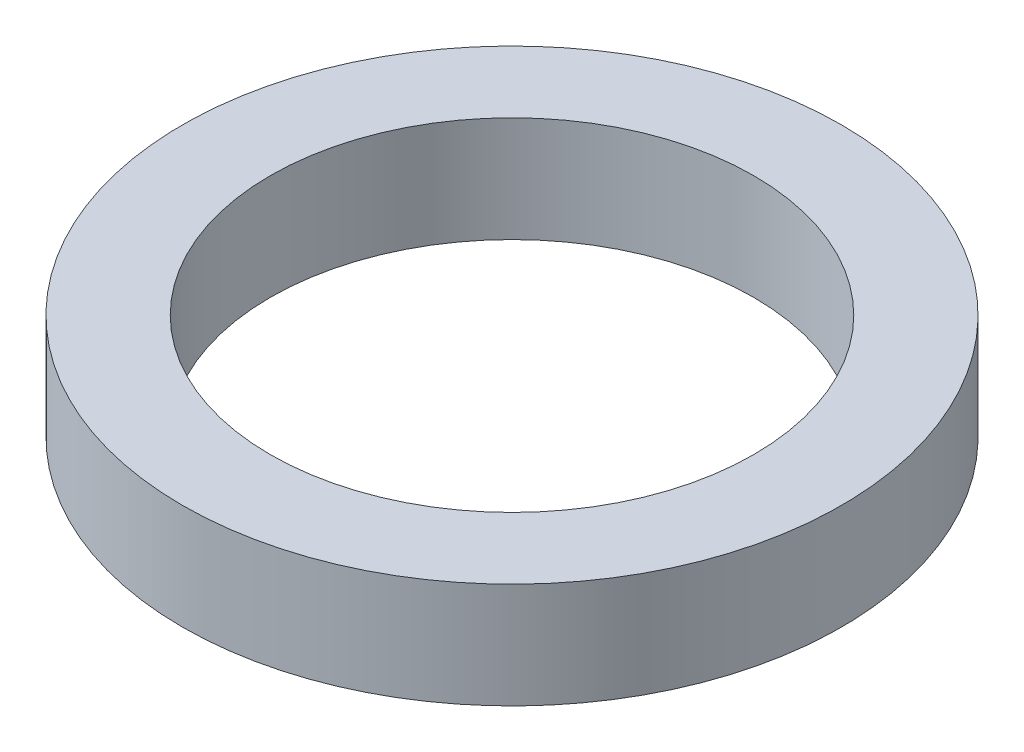
ISO-10303-21;
HEADER;
FILE_DESCRIPTION(('STEP AP214'),'2;1');
FILE_NAME('part.step','',(''),(''),'','','');
FILE_SCHEMA(('AUTOMOTIVE_DESIGN { 1 0 10303 214 1 1 1 1 }'));
ENDSEC;
DATA;
#1=APPLICATION_CONTEXT('core data for automotive mechanical design processes');
#2=APPLICATION_PROTOCOL_DEFINITION('international standard','automotive_design',2000,#1);
#3=PRODUCT_CONTEXT('',#1,'mechanical');
#4=PRODUCT('Part','Part','',(#3));
#5=PRODUCT_RELATED_PRODUCT_CATEGORY('part','',(#4));
#6=PRODUCT_DEFINITION_FORMATION('','',#4);
#7=PRODUCT_DEFINITION_CONTEXT('part definition',#1,'design');
#8=PRODUCT_DEFINITION('design','',#6,#7);
#9=PRODUCT_DEFINITION_SHAPE('','',#8);
#10=(LENGTH_UNIT() NAMED_UNIT(*) SI_UNIT(.MILLI.,.METRE.));
#11=(NAMED_UNIT(*) PLANE_ANGLE_UNIT() SI_UNIT($,.RADIAN.));
#12=(NAMED_UNIT(*) SI_UNIT($,.STERADIAN.) SOLID_ANGLE_UNIT());
#13=UNCERTAINTY_MEASURE_WITH_UNIT(LENGTH_MEASURE(1.E-05),#10,'distance_accuracy_value','');
#14=(GEOMETRIC_REPRESENTATION_CONTEXT(3) GLOBAL_UNCERTAINTY_ASSIGNED_CONTEXT((#13)) GLOBAL_UNIT_ASSIGNED_CONTEXT((#10,
#11,#12)) REPRESENTATION_CONTEXT('',''));
#15=CARTESIAN_POINT('',(0.,0.,0.));
#16=DIRECTION('',(0.,0.,1.));
#17=DIRECTION('',(1.,0.,0.));
#18=AXIS2_PLACEMENT_3D('',#15,#16,#17);
#19=CARTESIAN_POINT('',(0.,12.,0.));
#20=DIRECTION('',(0.,1.,0.));
#21=DIRECTION('',(0.,0.,1.));
#22=AXIS2_PLACEMENT_3D('',#19,#20,#21);
#23=PLANE('',#22);
#24=CARTESIAN_POINT('',(0.,12.,0.));
#25=DIRECTION('',(0.,-1.,0.));
#26=DIRECTION('',(0.,0.,-1.));
#27=AXIS2_PLACEMENT_3D('',#24,#25,#26);
#28=CIRCLE('',#27,37.5);
#29=CARTESIAN_POINT('',(0.,12.,-37.5));
#30=VERTEX_POINT('',#29);
#31=EDGE_CURVE('E26',#30,#30,#28,.T.);
#32=ORIENTED_EDGE('',*,*,#31,.F.);
#33=EDGE_LOOP('',(#32));
#34=FACE_BOUND('',#33,.T.);
#35=CARTESIAN_POINT('',(0.,12.,0.));
#36=DIRECTION('',(0.,1.,0.));
#37=DIRECTION('',(0.,0.,1.));
#38=AXIS2_PLACEMENT_3D('',#35,#36,#37);
#39=CIRCLE('',#38,27.5);
#40=CARTESIAN_POINT('',(0.,12.,27.5));
#41=VERTEX_POINT('',#40);
#42=EDGE_CURVE('E17',#41,#41,#39,.F.);
#43=ORIENTED_EDGE('',*,*,#42,.T.);
#44=EDGE_LOOP('',(#43));
#45=FACE_BOUND('',#44,.T.);
#46=ADVANCED_FACE('F14',(#34,#45),#23,.T.);
#47=CARTESIAN_POINT('',(0.,0.,0.));
#48=DIRECTION('',(0.,1.,0.));
#49=DIRECTION('',(0.,0.,1.));
#50=AXIS2_PLACEMENT_3D('',#47,#48,#49);
#51=CYLINDRICAL_SURFACE('',#50,27.5);
#52=CARTESIAN_POINT('',(0.,0.,0.));
#53=DIRECTION('',(0.,1.,0.));
#54=DIRECTION('',(0.,0.,1.));
#55=AXIS2_PLACEMENT_3D('',#52,#53,#54);
#56=CIRCLE('',#55,27.5);
#57=CARTESIAN_POINT('',(0.,0.,27.5));
#58=VERTEX_POINT('',#57);
#59=EDGE_CURVE('E21',#58,#58,#56,.F.);
#60=ORIENTED_EDGE('',*,*,#59,.T.);
#61=EDGE_LOOP('',(#60));
#62=FACE_BOUND('',#61,.T.);
#63=ORIENTED_EDGE('',*,*,#42,.F.);
#64=EDGE_LOOP('',(#63));
#65=FACE_BOUND('',#64,.T.);
#66=ADVANCED_FACE('F35',(#62,#65),#51,.F.);
#67=CARTESIAN_POINT('',(0.,12.,0.));
#68=DIRECTION('',(0.,-1.,0.));
#69=DIRECTION('',(0.,0.,-1.));
#70=AXIS2_PLACEMENT_3D('',#67,#68,#69);
#71=CYLINDRICAL_SURFACE('',#70,37.5);
#72=ORIENTED_EDGE('',*,*,#31,.T.);
#73=EDGE_LOOP('',(#72));
#74=FACE_BOUND('',#73,.T.);
#75=CARTESIAN_POINT('',(0.,0.,0.));
#76=DIRECTION('',(0.,-1.,0.));
#77=DIRECTION('',(0.,0.,-1.));
#78=AXIS2_PLACEMENT_3D('',#75,#76,#77);
#79=CIRCLE('',#78,37.5);
#80=CARTESIAN_POINT('',(0.,0.,-37.5));
#81=VERTEX_POINT('',#80);
#82=EDGE_CURVE('E10',#81,#81,#79,.F.);
#83=ORIENTED_EDGE('',*,*,#82,.T.);
#84=EDGE_LOOP('',(#83));
#85=FACE_BOUND('',#84,.T.);
#86=ADVANCED_FACE('F37',(#74,#85),#71,.T.);
#87=CARTESIAN_POINT('',(0.,0.,0.));
#88=DIRECTION('',(0.,1.,0.));
#89=DIRECTION('',(0.,0.,1.));
#90=AXIS2_PLACEMENT_3D('',#87,#88,#89);
#91=PLANE('',#90);
#92=ORIENTED_EDGE('',*,*,#82,.F.);
#93=EDGE_LOOP('',(#92));
#94=FACE_BOUND('',#93,.T.);
#95=ORIENTED_EDGE('',*,*,#59,.F.);
#96=EDGE_LOOP('',(#95));
#97=FACE_BOUND('',#96,.T.);
#98=ADVANCED_FACE('F45',(#94,#97),#91,.F.);
#99=CLOSED_SHELL('',(#46,#66,#86,#98));
#100=MANIFOLD_SOLID_BREP('B1',#99);
#101=ADVANCED_BREP_SHAPE_REPRESENTATION('',(#18,#100),#14);
#102=SHAPE_DEFINITION_REPRESENTATION(#9,#101);
ENDSEC;
END-ISO-10303-21;
